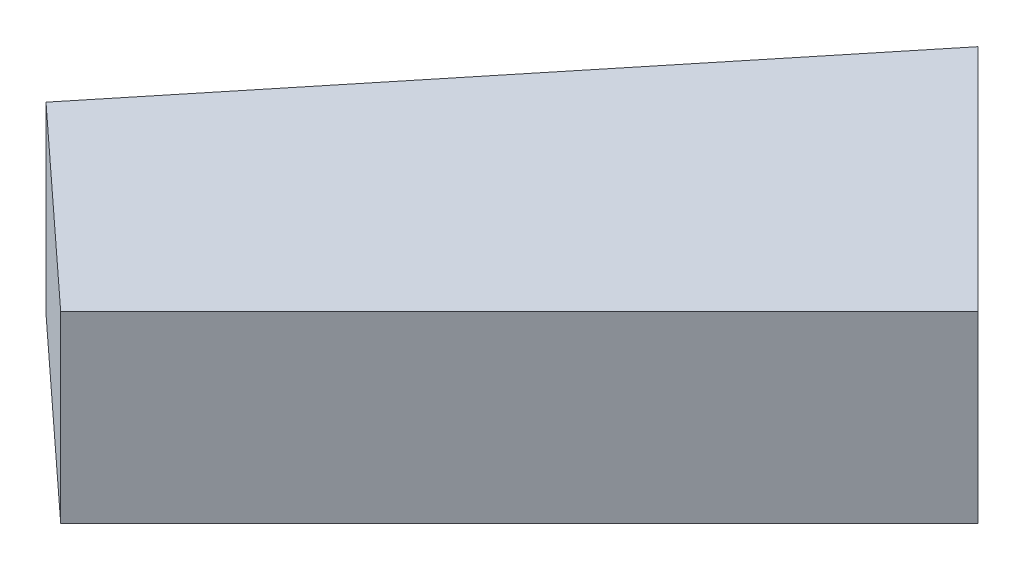
ISO-10303-21;
HEADER;
FILE_DESCRIPTION(('STEP AP214'),'2;1');
FILE_NAME('part.step','',(''),(''),'','','');
FILE_SCHEMA(('AUTOMOTIVE_DESIGN { 1 0 10303 214 1 1 1 1 }'));
ENDSEC;
DATA;
#1=APPLICATION_CONTEXT('core data for automotive mechanical design processes');
#2=APPLICATION_PROTOCOL_DEFINITION('international standard','automotive_design',2000,#1);
#3=PRODUCT_CONTEXT('',#1,'mechanical');
#4=PRODUCT('Part','Part','',(#3));
#5=PRODUCT_RELATED_PRODUCT_CATEGORY('part','',(#4));
#6=PRODUCT_DEFINITION_FORMATION('','',#4);
#7=PRODUCT_DEFINITION_CONTEXT('part definition',#1,'design');
#8=PRODUCT_DEFINITION('design','',#6,#7);
#9=PRODUCT_DEFINITION_SHAPE('','',#8);
#10=(LENGTH_UNIT() NAMED_UNIT(*) SI_UNIT(.MILLI.,.METRE.));
#11=(NAMED_UNIT(*) PLANE_ANGLE_UNIT() SI_UNIT($,.RADIAN.));
#12=(NAMED_UNIT(*) SI_UNIT($,.STERADIAN.) SOLID_ANGLE_UNIT());
#13=UNCERTAINTY_MEASURE_WITH_UNIT(LENGTH_MEASURE(1.E-05),#10,'distance_accuracy_value','');
#14=(GEOMETRIC_REPRESENTATION_CONTEXT(3) GLOBAL_UNCERTAINTY_ASSIGNED_CONTEXT((#13)) GLOBAL_UNIT_ASSIGNED_CONTEXT((#10,
#11,#12)) REPRESENTATION_CONTEXT('',''));
#15=CARTESIAN_POINT('',(0.,0.,0.));
#16=DIRECTION('',(0.,0.,1.));
#17=DIRECTION('',(1.,0.,0.));
#18=AXIS2_PLACEMENT_3D('',#15,#16,#17);
#19=CARTESIAN_POINT('',(99.43,-4.,43.63));
#20=DIRECTION('',(0.677923610644385,0.,-0.735132354158679));
#21=DIRECTION('',(-0.735132354158679,0.,-0.677923610644385));
#22=AXIS2_PLACEMENT_3D('',#19,#20,#21);
#23=PLANE('',#22);
#24=DIRECTION('',(0.735132354158679,0.,0.677923610644385));
#25=VECTOR('',#24,1.);
#26=CARTESIAN_POINT('',(99.43,-9.,43.63));
#27=LINE('',#26,#25);
#28=CARTESIAN_POINT('',(99.43,-9.,43.63));
#29=VERTEX_POINT('',#28);
#30=CARTESIAN_POINT('',(104.57,-9.,48.37));
#31=VERTEX_POINT('',#30);
#32=EDGE_CURVE('E102',#29,#31,#27,.T.);
#33=ORIENTED_EDGE('',*,*,#32,.T.);
#34=DIRECTION('',(0.,-1.,0.));
#35=VECTOR('',#34,1.);
#36=CARTESIAN_POINT('',(104.57,-4.,48.37));
#37=LINE('',#36,#35);
#38=CARTESIAN_POINT('',(104.57,-4.,48.37));
#39=VERTEX_POINT('',#38);
#40=EDGE_CURVE('E11',#39,#31,#37,.T.);
#41=ORIENTED_EDGE('',*,*,#40,.F.);
#42=DIRECTION('',(0.735132354158679,0.,0.677923610644385));
#43=VECTOR('',#42,1.);
#44=CARTESIAN_POINT('',(99.43,-4.,43.63));
#45=LINE('',#44,#43);
#46=CARTESIAN_POINT('',(99.43,-4.,43.63));
#47=VERTEX_POINT('',#46);
#48=EDGE_CURVE('E95',#47,#39,#45,.T.);
#49=ORIENTED_EDGE('',*,*,#48,.F.);
#50=DIRECTION('',(0.,-1.,0.));
#51=VECTOR('',#50,1.);
#52=CARTESIAN_POINT('',(99.43,-4.,43.63));
#53=LINE('',#52,#51);
#54=EDGE_CURVE('E99',#47,#29,#53,.T.);
#55=ORIENTED_EDGE('',*,*,#54,.T.);
#56=EDGE_LOOP('',(#33,#41,#49,#55));
#57=FACE_BOUND('',#56,.T.);
#58=ADVANCED_FACE('F41',(#57),#23,.F.);
#59=CARTESIAN_POINT('',(104.57,-4.,48.37));
#60=DIRECTION('',(-0.707106781186549,0.,-0.707106781186546));
#61=DIRECTION('',(-0.707106781186546,0.,0.707106781186549));
#62=AXIS2_PLACEMENT_3D('',#59,#60,#61);
#63=PLANE('',#62);
#64=DIRECTION('',(0.707106781186546,0.,-0.707106781186549));
#65=VECTOR('',#64,1.);
#66=CARTESIAN_POINT('',(104.57,-9.,48.37));
#67=LINE('',#66,#65);
#68=CARTESIAN_POINT('',(117.07,-9.,35.87));
#69=VERTEX_POINT('',#68);
#70=EDGE_CURVE('E96',#31,#69,#67,.T.);
#71=ORIENTED_EDGE('',*,*,#70,.T.);
#72=DIRECTION('',(0.,-1.,0.));
#73=VECTOR('',#72,1.);
#74=CARTESIAN_POINT('',(117.07,-4.,35.87));
#75=LINE('',#74,#73);
#76=CARTESIAN_POINT('',(117.07,-4.,35.87));
#77=VERTEX_POINT('',#76);
#78=EDGE_CURVE('E47',#77,#69,#75,.T.);
#79=ORIENTED_EDGE('',*,*,#78,.F.);
#80=DIRECTION('',(0.707106781186546,0.,-0.707106781186549));
#81=VECTOR('',#80,1.);
#82=CARTESIAN_POINT('',(104.57,-4.,48.37));
#83=LINE('',#82,#81);
#84=EDGE_CURVE('E87',#39,#77,#83,.T.);
#85=ORIENTED_EDGE('',*,*,#84,.F.);
#86=ORIENTED_EDGE('',*,*,#40,.T.);
#87=EDGE_LOOP('',(#71,#79,#85,#86));
#88=FACE_BOUND('',#87,.T.);
#89=ADVANCED_FACE('F92',(#88),#63,.F.);
#90=CARTESIAN_POINT('',(117.07,-4.,35.87));
#91=DIRECTION('',(-0.707106781186546,0.,0.707106781186549));
#92=DIRECTION('',(0.707106781186549,0.,0.707106781186546));
#93=AXIS2_PLACEMENT_3D('',#90,#91,#92);
#94=PLANE('',#93);
#95=DIRECTION('',(-0.707106781186549,0.,-0.707106781186546));
#96=VECTOR('',#95,1.);
#97=CARTESIAN_POINT('',(117.07,-9.,35.87));
#98=LINE('',#97,#96);
#99=CARTESIAN_POINT('',(110.82,-9.,29.62));
#100=VERTEX_POINT('',#99);
#101=EDGE_CURVE('E74',#69,#100,#98,.T.);
#102=ORIENTED_EDGE('',*,*,#101,.T.);
#103=DIRECTION('',(0.,-1.,0.));
#104=VECTOR('',#103,1.);
#105=CARTESIAN_POINT('',(110.82,-4.,29.62));
#106=LINE('',#105,#104);
#107=CARTESIAN_POINT('',(110.82,-4.,29.62));
#108=VERTEX_POINT('',#107);
#109=EDGE_CURVE('E100',#108,#100,#106,.T.);
#110=ORIENTED_EDGE('',*,*,#109,.F.);
#111=DIRECTION('',(-0.707106781186549,0.,-0.707106781186546));
#112=VECTOR('',#111,1.);
#113=CARTESIAN_POINT('',(117.07,-4.,35.87));
#114=LINE('',#113,#112);
#115=EDGE_CURVE('E89',#77,#108,#114,.T.);
#116=ORIENTED_EDGE('',*,*,#115,.F.);
#117=ORIENTED_EDGE('',*,*,#78,.T.);
#118=EDGE_LOOP('',(#102,#110,#116,#117));
#119=FACE_BOUND('',#118,.T.);
#120=ADVANCED_FACE('F98',(#119),#94,.F.);
#121=CARTESIAN_POINT('',(110.82,-4.,29.62));
#122=DIRECTION('',(0.775927615890879,0.,0.630821951819922));
#123=DIRECTION('',(0.630821951819922,0.,-0.775927615890879));
#124=AXIS2_PLACEMENT_3D('',#121,#122,#123);
#125=PLANE('',#124);
#126=DIRECTION('',(-0.630821951819922,0.,0.775927615890879));
#127=VECTOR('',#126,1.);
#128=CARTESIAN_POINT('',(110.82,-9.,29.62));
#129=LINE('',#128,#127);
#130=EDGE_CURVE('E79',#100,#29,#129,.T.);
#131=ORIENTED_EDGE('',*,*,#130,.T.);
#132=ORIENTED_EDGE('',*,*,#54,.F.);
#133=DIRECTION('',(-0.630821951819922,0.,0.775927615890879));
#134=VECTOR('',#133,1.);
#135=CARTESIAN_POINT('',(110.82,-4.,29.62));
#136=LINE('',#135,#134);
#137=EDGE_CURVE('E60',#108,#47,#136,.T.);
#138=ORIENTED_EDGE('',*,*,#137,.F.);
#139=ORIENTED_EDGE('',*,*,#109,.T.);
#140=EDGE_LOOP('',(#131,#132,#138,#139));
#141=FACE_BOUND('',#140,.T.);
#142=ADVANCED_FACE('F112',(#141),#125,.F.);
#143=CARTESIAN_POINT('',(0.,-4.,0.));
#144=DIRECTION('',(0.,1.,0.));
#145=DIRECTION('',(0.,0.,1.));
#146=AXIS2_PLACEMENT_3D('',#143,#144,#145);
#147=PLANE('',#146);
#148=ORIENTED_EDGE('',*,*,#48,.T.);
#149=ORIENTED_EDGE('',*,*,#84,.T.);
#150=ORIENTED_EDGE('',*,*,#115,.T.);
#151=ORIENTED_EDGE('',*,*,#137,.T.);
#152=EDGE_LOOP('',(#148,#149,#150,#151));
#153=FACE_BOUND('',#152,.T.);
#154=ADVANCED_FACE('F86',(#153),#147,.T.);
#155=CARTESIAN_POINT('',(0.,-9.,0.));
#156=DIRECTION('',(0.,1.,0.));
#157=DIRECTION('',(0.,0.,1.));
#158=AXIS2_PLACEMENT_3D('',#155,#156,#157);
#159=PLANE('',#158);
#160=ORIENTED_EDGE('',*,*,#32,.F.);
#161=ORIENTED_EDGE('',*,*,#130,.F.);
#162=ORIENTED_EDGE('',*,*,#101,.F.);
#163=ORIENTED_EDGE('',*,*,#70,.F.);
#164=EDGE_LOOP('',(#160,#161,#162,#163));
#165=FACE_BOUND('',#164,.T.);
#166=ADVANCED_FACE('F111',(#165),#159,.F.);
#167=CLOSED_SHELL('',(#58,#89,#120,#142,#154,#166));
#168=MANIFOLD_SOLID_BREP('B2',#167);
#169=ADVANCED_BREP_SHAPE_REPRESENTATION('',(#18,#168),#14);
#170=SHAPE_DEFINITION_REPRESENTATION(#9,#169);
ENDSEC;
END-ISO-10303-21;
